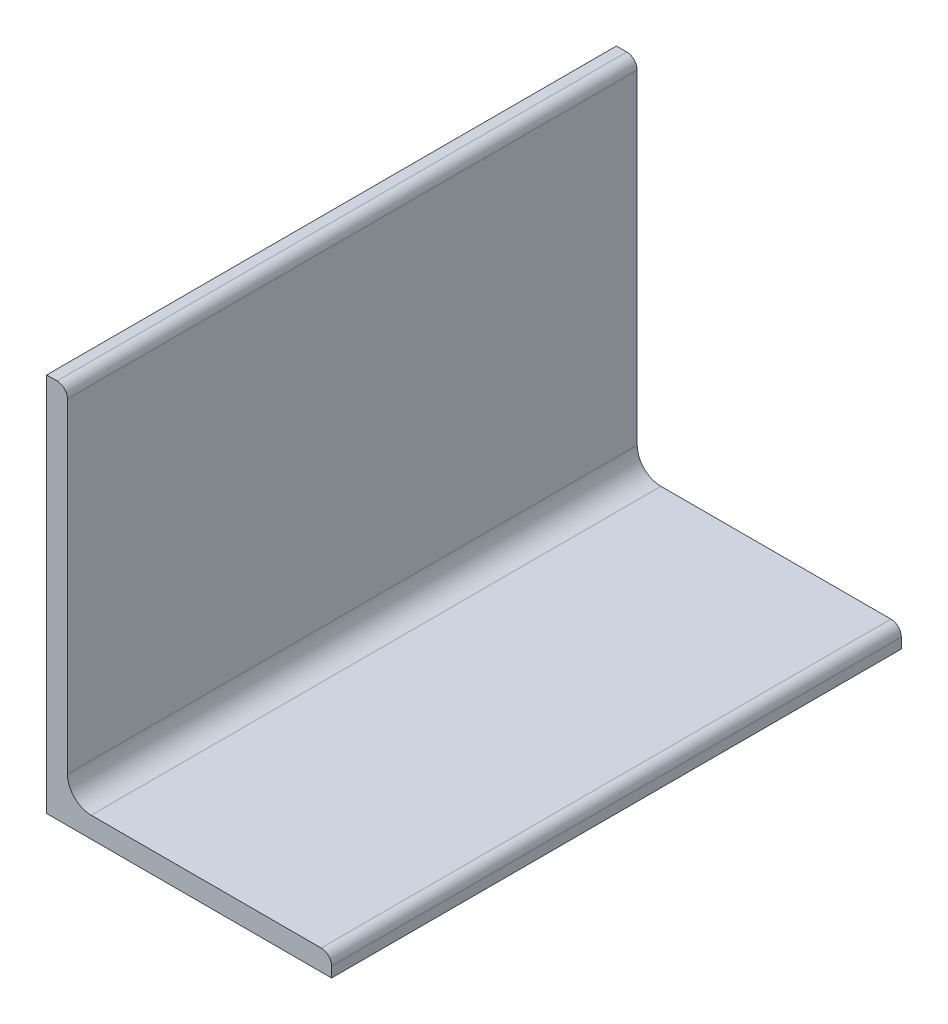
ISO-10303-21;
HEADER;
FILE_DESCRIPTION(('STEP AP214'),'2;1');
FILE_NAME('part.step','',(''),(''),'','','');
FILE_SCHEMA(('AUTOMOTIVE_DESIGN { 1 0 10303 214 1 1 1 1 }'));
ENDSEC;
DATA;
#1=APPLICATION_CONTEXT('core data for automotive mechanical design processes');
#2=APPLICATION_PROTOCOL_DEFINITION('international standard','automotive_design',2000,#1);
#3=PRODUCT_CONTEXT('',#1,'mechanical');
#4=PRODUCT('Part','Part','',(#3));
#5=PRODUCT_RELATED_PRODUCT_CATEGORY('part','',(#4));
#6=PRODUCT_DEFINITION_FORMATION('','',#4);
#7=PRODUCT_DEFINITION_CONTEXT('part definition',#1,'design');
#8=PRODUCT_DEFINITION('design','',#6,#7);
#9=PRODUCT_DEFINITION_SHAPE('','',#8);
#10=(LENGTH_UNIT() NAMED_UNIT(*) SI_UNIT(.MILLI.,.METRE.));
#11=(NAMED_UNIT(*) PLANE_ANGLE_UNIT() SI_UNIT($,.RADIAN.));
#12=(NAMED_UNIT(*) SI_UNIT($,.STERADIAN.) SOLID_ANGLE_UNIT());
#13=UNCERTAINTY_MEASURE_WITH_UNIT(LENGTH_MEASURE(1.E-05),#10,'distance_accuracy_value','');
#14=(GEOMETRIC_REPRESENTATION_CONTEXT(3) GLOBAL_UNCERTAINTY_ASSIGNED_CONTEXT((#13)) GLOBAL_UNIT_ASSIGNED_CONTEXT((#10,
#11,#12)) REPRESENTATION_CONTEXT('',''));
#15=CARTESIAN_POINT('',(0.,0.,0.));
#16=DIRECTION('',(0.,0.,1.));
#17=DIRECTION('',(1.,0.,0.));
#18=AXIS2_PLACEMENT_3D('',#15,#16,#17);
#19=CARTESIAN_POINT('',(0.425014111727251,203.678837479771,304.8));
#20=DIRECTION('',(1.,0.,0.));
#21=DIRECTION('',(0.,0.,-1.));
#22=AXIS2_PLACEMENT_3D('',#19,#20,#21);
#23=PLANE('',#22);
#24=DIRECTION('',(0.,-1.,0.));
#25=VECTOR('',#24,1.);
#26=CARTESIAN_POINT('',(0.425014111727251,203.678837479771,0.));
#27=LINE('',#26,#25);
#28=CARTESIAN_POINT('',(0.425014111727251,203.678837479771,0.));
#29=VERTEX_POINT('',#28);
#30=CARTESIAN_POINT('',(0.425014111727251,0.478837479771528,0.));
#31=VERTEX_POINT('',#30);
#32=EDGE_CURVE('E135',#29,#31,#27,.T.);
#33=ORIENTED_EDGE('',*,*,#32,.T.);
#34=DIRECTION('',(0.,0.,-1.));
#35=VECTOR('',#34,1.);
#36=CARTESIAN_POINT('',(0.425014111727251,0.478837479771528,304.8));
#37=LINE('',#36,#35);
#38=CARTESIAN_POINT('',(0.425014111727251,0.478837479771528,304.8));
#39=VERTEX_POINT('',#38);
#40=EDGE_CURVE('E11',#39,#31,#37,.T.);
#41=ORIENTED_EDGE('',*,*,#40,.F.);
#42=DIRECTION('',(0.,-1.,0.));
#43=VECTOR('',#42,1.);
#44=CARTESIAN_POINT('',(0.425014111727251,203.678837479771,304.8));
#45=LINE('',#44,#43);
#46=CARTESIAN_POINT('',(0.425014111727251,203.678837479771,304.8));
#47=VERTEX_POINT('',#46);
#48=EDGE_CURVE('E151',#47,#39,#45,.T.);
#49=ORIENTED_EDGE('',*,*,#48,.F.);
#50=DIRECTION('',(0.,0.,-1.));
#51=VECTOR('',#50,1.);
#52=CARTESIAN_POINT('',(0.425014111727251,203.678837479771,304.8));
#53=LINE('',#52,#51);
#54=EDGE_CURVE('E131',#47,#29,#53,.T.);
#55=ORIENTED_EDGE('',*,*,#54,.T.);
#56=EDGE_LOOP('',(#33,#41,#49,#55));
#57=FACE_BOUND('',#56,.T.);
#58=ADVANCED_FACE('F33',(#57),#23,.F.);
#59=CARTESIAN_POINT('',(0.425014111727251,0.478837479771528,304.8));
#60=DIRECTION('',(0.,1.,0.));
#61=DIRECTION('',(0.,0.,1.));
#62=AXIS2_PLACEMENT_3D('',#59,#60,#61);
#63=PLANE('',#62);
#64=DIRECTION('',(1.,0.,0.));
#65=VECTOR('',#64,1.);
#66=CARTESIAN_POINT('',(0.425014111727251,0.478837479771528,0.));
#67=LINE('',#66,#65);
#68=CARTESIAN_POINT('',(152.825014111727,0.478837479771528,0.));
#69=VERTEX_POINT('',#68);
#70=EDGE_CURVE('E138',#31,#69,#67,.T.);
#71=ORIENTED_EDGE('',*,*,#70,.T.);
#72=DIRECTION('',(0.,0.,-1.));
#73=VECTOR('',#72,1.);
#74=CARTESIAN_POINT('',(152.825014111727,0.478837479771528,304.8));
#75=LINE('',#74,#73);
#76=CARTESIAN_POINT('',(152.825014111727,0.478837479771528,304.8));
#77=VERTEX_POINT('',#76);
#78=EDGE_CURVE('E41',#77,#69,#75,.T.);
#79=ORIENTED_EDGE('',*,*,#78,.F.);
#80=DIRECTION('',(1.,0.,0.));
#81=VECTOR('',#80,1.);
#82=CARTESIAN_POINT('',(0.425014111727251,0.478837479771528,304.8));
#83=LINE('',#82,#81);
#84=EDGE_CURVE('E95',#39,#77,#83,.T.);
#85=ORIENTED_EDGE('',*,*,#84,.F.);
#86=ORIENTED_EDGE('',*,*,#40,.T.);
#87=EDGE_LOOP('',(#71,#79,#85,#86));
#88=FACE_BOUND('',#87,.T.);
#89=ADVANCED_FACE('F194',(#88),#63,.F.);
#90=CARTESIAN_POINT('',(152.825014111727,0.478837479771528,304.8));
#91=DIRECTION('',(-1.,0.,0.));
#92=DIRECTION('',(0.,0.,1.));
#93=AXIS2_PLACEMENT_3D('',#90,#91,#92);
#94=PLANE('',#93);
#95=DIRECTION('',(0.,1.,0.));
#96=VECTOR('',#95,1.);
#97=CARTESIAN_POINT('',(152.825014111727,0.478837479771528,0.));
#98=LINE('',#97,#96);
#99=CARTESIAN_POINT('',(152.825014111727,6.03508747977153,0.));
#100=VERTEX_POINT('',#99);
#101=EDGE_CURVE('E140',#69,#100,#98,.T.);
#102=ORIENTED_EDGE('',*,*,#101,.T.);
#103=DIRECTION('',(0.,0.,-1.));
#104=VECTOR('',#103,1.);
#105=CARTESIAN_POINT('',(152.825014111727,6.03508747977153,304.8));
#106=LINE('',#105,#104);
#107=CARTESIAN_POINT('',(152.825014111727,6.03508747977153,304.8));
#108=VERTEX_POINT('',#107);
#109=EDGE_CURVE('E161',#108,#100,#106,.T.);
#110=ORIENTED_EDGE('',*,*,#109,.F.);
#111=DIRECTION('',(0.,1.,0.));
#112=VECTOR('',#111,1.);
#113=CARTESIAN_POINT('',(152.825014111727,0.478837479771528,304.8));
#114=LINE('',#113,#112);
#115=EDGE_CURVE('E169',#77,#108,#114,.T.);
#116=ORIENTED_EDGE('',*,*,#115,.F.);
#117=ORIENTED_EDGE('',*,*,#78,.T.);
#118=EDGE_LOOP('',(#102,#110,#116,#117));
#119=FACE_BOUND('',#118,.T.);
#120=ADVANCED_FACE('F167',(#119),#94,.F.);
#121=CARTESIAN_POINT('',(147.268764111727,6.03508747977153,304.8));
#122=DIRECTION('',(0.,0.,-1.));
#123=DIRECTION('',(-1.,0.,0.));
#124=AXIS2_PLACEMENT_3D('',#121,#122,#123);
#125=CYLINDRICAL_SURFACE('',#124,5.55625000000001);
#126=CARTESIAN_POINT('',(147.268764111727,6.03508747977153,0.));
#127=DIRECTION('',(0.,0.,1.));
#128=DIRECTION('',(1.,0.,0.));
#129=AXIS2_PLACEMENT_3D('',#126,#127,#128);
#130=CIRCLE('',#129,5.55625000000001);
#131=CARTESIAN_POINT('',(147.268764111727,11.5913374797715,0.));
#132=VERTEX_POINT('',#131);
#133=EDGE_CURVE('E142',#100,#132,#130,.T.);
#134=ORIENTED_EDGE('',*,*,#133,.T.);
#135=DIRECTION('',(0.,0.,-1.));
#136=VECTOR('',#135,1.);
#137=CARTESIAN_POINT('',(147.268764111727,11.5913374797715,304.8));
#138=LINE('',#137,#136);
#139=CARTESIAN_POINT('',(147.268764111727,11.5913374797715,304.8));
#140=VERTEX_POINT('',#139);
#141=EDGE_CURVE('E158',#140,#132,#138,.T.);
#142=ORIENTED_EDGE('',*,*,#141,.F.);
#143=CARTESIAN_POINT('',(147.268764111727,6.03508747977153,304.8));
#144=DIRECTION('',(0.,0.,1.));
#145=DIRECTION('',(1.,0.,0.));
#146=AXIS2_PLACEMENT_3D('',#143,#144,#145);
#147=CIRCLE('',#146,5.55625000000001);
#148=EDGE_CURVE('E185',#108,#140,#147,.T.);
#149=ORIENTED_EDGE('',*,*,#148,.F.);
#150=ORIENTED_EDGE('',*,*,#109,.T.);
#151=EDGE_LOOP('',(#134,#142,#149,#150));
#152=FACE_BOUND('',#151,.T.);
#153=ADVANCED_FACE('F178',(#152),#125,.T.);
#154=CARTESIAN_POINT('',(147.268764111727,11.5913374797715,304.8));
#155=DIRECTION('',(0.,-1.,0.));
#156=DIRECTION('',(0.,0.,-1.));
#157=AXIS2_PLACEMENT_3D('',#154,#155,#156);
#158=PLANE('',#157);
#159=DIRECTION('',(-1.,0.,0.));
#160=VECTOR('',#159,1.);
#161=CARTESIAN_POINT('',(147.268764111727,11.5913374797715,0.));
#162=LINE('',#161,#160);
#163=CARTESIAN_POINT('',(24.2375141117273,11.5913374797715,0.));
#164=VERTEX_POINT('',#163);
#165=EDGE_CURVE('E144',#132,#164,#162,.T.);
#166=ORIENTED_EDGE('',*,*,#165,.T.);
#167=DIRECTION('',(0.,0.,-1.));
#168=VECTOR('',#167,1.);
#169=CARTESIAN_POINT('',(24.2375141117273,11.5913374797715,304.8));
#170=LINE('',#169,#168);
#171=CARTESIAN_POINT('',(24.2375141117273,11.5913374797715,304.8));
#172=VERTEX_POINT('',#171);
#173=EDGE_CURVE('E155',#172,#164,#170,.T.);
#174=ORIENTED_EDGE('',*,*,#173,.F.);
#175=DIRECTION('',(-1.,0.,0.));
#176=VECTOR('',#175,1.);
#177=CARTESIAN_POINT('',(147.268764111727,11.5913374797715,304.8));
#178=LINE('',#177,#176);
#179=EDGE_CURVE('E184',#140,#172,#178,.T.);
#180=ORIENTED_EDGE('',*,*,#179,.F.);
#181=ORIENTED_EDGE('',*,*,#141,.T.);
#182=EDGE_LOOP('',(#166,#174,#180,#181));
#183=FACE_BOUND('',#182,.T.);
#184=ADVANCED_FACE('F182',(#183),#158,.F.);
#185=CARTESIAN_POINT('',(24.2375141117272,24.2913374797715,304.8));
#186=DIRECTION('',(0.,0.,-1.));
#187=DIRECTION('',(-1.,0.,0.));
#188=AXIS2_PLACEMENT_3D('',#185,#186,#187);
#189=CYLINDRICAL_SURFACE('',#188,12.7);
#190=CARTESIAN_POINT('',(24.2375141117272,24.2913374797715,0.));
#191=DIRECTION('',(0.,0.,-1.));
#192=DIRECTION('',(1.,0.,0.));
#193=AXIS2_PLACEMENT_3D('',#190,#191,#192);
#194=CIRCLE('',#193,12.7);
#195=CARTESIAN_POINT('',(11.5375141117273,24.2913374797715,0.));
#196=VERTEX_POINT('',#195);
#197=EDGE_CURVE('E146',#164,#196,#194,.T.);
#198=ORIENTED_EDGE('',*,*,#197,.T.);
#199=DIRECTION('',(0.,0.,-1.));
#200=VECTOR('',#199,1.);
#201=CARTESIAN_POINT('',(11.5375141117273,24.2913374797715,304.8));
#202=LINE('',#201,#200);
#203=CARTESIAN_POINT('',(11.5375141117273,24.2913374797715,304.8));
#204=VERTEX_POINT('',#203);
#205=EDGE_CURVE('E126',#204,#196,#202,.T.);
#206=ORIENTED_EDGE('',*,*,#205,.F.);
#207=CARTESIAN_POINT('',(24.2375141117272,24.2913374797715,304.8));
#208=DIRECTION('',(0.,0.,-1.));
#209=DIRECTION('',(1.,0.,0.));
#210=AXIS2_PLACEMENT_3D('',#207,#208,#209);
#211=CIRCLE('',#210,12.7);
#212=EDGE_CURVE('E117',#172,#204,#211,.T.);
#213=ORIENTED_EDGE('',*,*,#212,.F.);
#214=ORIENTED_EDGE('',*,*,#173,.T.);
#215=EDGE_LOOP('',(#198,#206,#213,#214));
#216=FACE_BOUND('',#215,.T.);
#217=ADVANCED_FACE('F206',(#216),#189,.F.);
#218=CARTESIAN_POINT('',(11.5375141117273,24.2913374797715,304.8));
#219=DIRECTION('',(-1.,0.,0.));
#220=DIRECTION('',(0.,0.,1.));
#221=AXIS2_PLACEMENT_3D('',#218,#219,#220);
#222=PLANE('',#221);
#223=DIRECTION('',(0.,1.,0.));
#224=VECTOR('',#223,1.);
#225=CARTESIAN_POINT('',(11.5375141117273,24.2913374797715,0.));
#226=LINE('',#225,#224);
#227=CARTESIAN_POINT('',(11.5375141117273,198.122587479771,0.));
#228=VERTEX_POINT('',#227);
#229=EDGE_CURVE('E125',#196,#228,#226,.T.);
#230=ORIENTED_EDGE('',*,*,#229,.T.);
#231=DIRECTION('',(0.,0.,-1.));
#232=VECTOR('',#231,1.);
#233=CARTESIAN_POINT('',(11.5375141117273,198.122587479771,304.8));
#234=LINE('',#233,#232);
#235=CARTESIAN_POINT('',(11.5375141117273,198.122587479771,304.8));
#236=VERTEX_POINT('',#235);
#237=EDGE_CURVE('E122',#236,#228,#234,.T.);
#238=ORIENTED_EDGE('',*,*,#237,.F.);
#239=DIRECTION('',(0.,1.,0.));
#240=VECTOR('',#239,1.);
#241=CARTESIAN_POINT('',(11.5375141117273,24.2913374797715,304.8));
#242=LINE('',#241,#240);
#243=EDGE_CURVE('E111',#204,#236,#242,.T.);
#244=ORIENTED_EDGE('',*,*,#243,.F.);
#245=ORIENTED_EDGE('',*,*,#205,.T.);
#246=EDGE_LOOP('',(#230,#238,#244,#245));
#247=FACE_BOUND('',#246,.T.);
#248=ADVANCED_FACE('F123',(#247),#222,.F.);
#249=CARTESIAN_POINT('',(5.98126411172724,198.122587479771,304.8));
#250=DIRECTION('',(0.,0.,-1.));
#251=DIRECTION('',(-1.,0.,0.));
#252=AXIS2_PLACEMENT_3D('',#249,#250,#251);
#253=CYLINDRICAL_SURFACE('',#252,5.55625000000001);
#254=CARTESIAN_POINT('',(5.98126411172724,198.122587479771,0.));
#255=DIRECTION('',(0.,0.,1.));
#256=DIRECTION('',(1.,0.,0.));
#257=AXIS2_PLACEMENT_3D('',#254,#255,#256);
#258=CIRCLE('',#257,5.55625000000001);
#259=CARTESIAN_POINT('',(5.98126411172725,203.678837479771,0.));
#260=VERTEX_POINT('',#259);
#261=EDGE_CURVE('E81',#228,#260,#258,.T.);
#262=ORIENTED_EDGE('',*,*,#261,.T.);
#263=DIRECTION('',(0.,0.,-1.));
#264=VECTOR('',#263,1.);
#265=CARTESIAN_POINT('',(5.98126411172725,203.678837479771,304.8));
#266=LINE('',#265,#264);
#267=CARTESIAN_POINT('',(5.98126411172725,203.678837479771,304.8));
#268=VERTEX_POINT('',#267);
#269=EDGE_CURVE('E127',#268,#260,#266,.T.);
#270=ORIENTED_EDGE('',*,*,#269,.F.);
#271=CARTESIAN_POINT('',(5.98126411172724,198.122587479771,304.8));
#272=DIRECTION('',(0.,0.,1.));
#273=DIRECTION('',(1.,0.,0.));
#274=AXIS2_PLACEMENT_3D('',#271,#272,#273);
#275=CIRCLE('',#274,5.55625000000001);
#276=EDGE_CURVE('E115',#236,#268,#275,.T.);
#277=ORIENTED_EDGE('',*,*,#276,.F.);
#278=ORIENTED_EDGE('',*,*,#237,.T.);
#279=EDGE_LOOP('',(#262,#270,#277,#278));
#280=FACE_BOUND('',#279,.T.);
#281=ADVANCED_FACE('F129',(#280),#253,.T.);
#282=CARTESIAN_POINT('',(5.98126411172725,203.678837479771,304.8));
#283=DIRECTION('',(0.,-1.,0.));
#284=DIRECTION('',(0.,0.,-1.));
#285=AXIS2_PLACEMENT_3D('',#282,#283,#284);
#286=PLANE('',#285);
#287=DIRECTION('',(-1.,0.,0.));
#288=VECTOR('',#287,1.);
#289=CARTESIAN_POINT('',(5.98126411172725,203.678837479771,0.));
#290=LINE('',#289,#288);
#291=EDGE_CURVE('E87',#260,#29,#290,.T.);
#292=ORIENTED_EDGE('',*,*,#291,.T.);
#293=ORIENTED_EDGE('',*,*,#54,.F.);
#294=DIRECTION('',(-1.,0.,0.));
#295=VECTOR('',#294,1.);
#296=CARTESIAN_POINT('',(5.98126411172725,203.678837479771,304.8));
#297=LINE('',#296,#295);
#298=EDGE_CURVE('E49',#268,#47,#297,.T.);
#299=ORIENTED_EDGE('',*,*,#298,.F.);
#300=ORIENTED_EDGE('',*,*,#269,.T.);
#301=EDGE_LOOP('',(#292,#293,#299,#300));
#302=FACE_BOUND('',#301,.T.);
#303=ADVANCED_FACE('F214',(#302),#286,.F.);
#304=CARTESIAN_POINT('',(147.268764111727,6.03508747977153,304.8));
#305=DIRECTION('',(0.,0.,1.));
#306=DIRECTION('',(1.,0.,0.));
#307=AXIS2_PLACEMENT_3D('',#304,#305,#306);
#308=PLANE('',#307);
#309=ORIENTED_EDGE('',*,*,#48,.T.);
#310=ORIENTED_EDGE('',*,*,#84,.T.);
#311=ORIENTED_EDGE('',*,*,#115,.T.);
#312=ORIENTED_EDGE('',*,*,#148,.T.);
#313=ORIENTED_EDGE('',*,*,#179,.T.);
#314=ORIENTED_EDGE('',*,*,#212,.T.);
#315=ORIENTED_EDGE('',*,*,#243,.T.);
#316=ORIENTED_EDGE('',*,*,#276,.T.);
#317=ORIENTED_EDGE('',*,*,#298,.T.);
#318=EDGE_LOOP('',(#309,#310,#311,#312,#313,#314,#315,#316,#317));
#319=FACE_BOUND('',#318,.T.);
#320=ADVANCED_FACE('F113',(#319),#308,.T.);
#321=CARTESIAN_POINT('',(147.268764111727,6.03508747977153,0.));
#322=DIRECTION('',(0.,0.,1.));
#323=DIRECTION('',(1.,0.,0.));
#324=AXIS2_PLACEMENT_3D('',#321,#322,#323);
#325=PLANE('',#324);
#326=ORIENTED_EDGE('',*,*,#32,.F.);
#327=ORIENTED_EDGE('',*,*,#291,.F.);
#328=ORIENTED_EDGE('',*,*,#261,.F.);
#329=ORIENTED_EDGE('',*,*,#229,.F.);
#330=ORIENTED_EDGE('',*,*,#197,.F.);
#331=ORIENTED_EDGE('',*,*,#165,.F.);
#332=ORIENTED_EDGE('',*,*,#133,.F.);
#333=ORIENTED_EDGE('',*,*,#101,.F.);
#334=ORIENTED_EDGE('',*,*,#70,.F.);
#335=EDGE_LOOP('',(#326,#327,#328,#329,#330,#331,#332,#333,#334));
#336=FACE_BOUND('',#335,.T.);
#337=ADVANCED_FACE('F173',(#336),#325,.F.);
#338=CLOSED_SHELL('',(#58,#89,#120,#153,#184,#217,#248,#281,#303,#320,#337));
#339=MANIFOLD_SOLID_BREP('B2',#338);
#340=ADVANCED_BREP_SHAPE_REPRESENTATION('',(#18,#339),#14);
#341=SHAPE_DEFINITION_REPRESENTATION(#9,#340);
ENDSEC;
END-ISO-10303-21;
